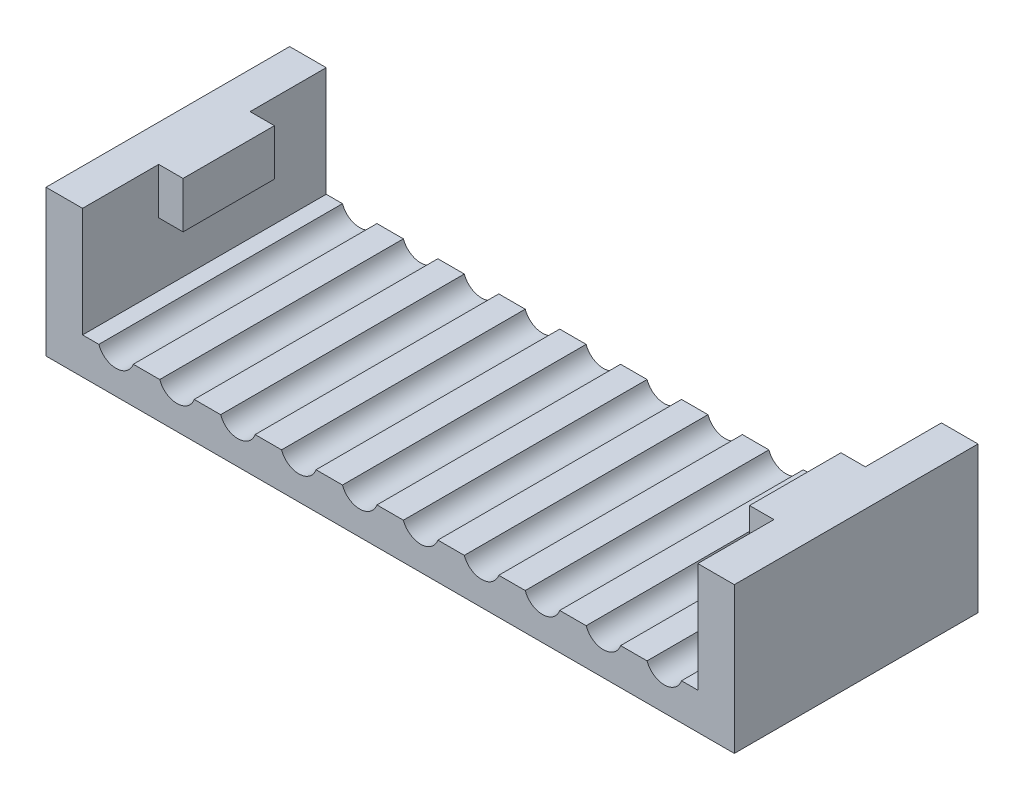
ISO-10303-21;
HEADER;
FILE_DESCRIPTION(('STEP AP214'),'2;1');
FILE_NAME('part.step','',(''),(''),'','','');
FILE_SCHEMA(('AUTOMOTIVE_DESIGN { 1 0 10303 214 1 1 1 1 }'));
ENDSEC;
DATA;
#1=APPLICATION_CONTEXT('core data for automotive mechanical design processes');
#2=APPLICATION_PROTOCOL_DEFINITION('international standard','automotive_design',2000,#1);
#3=PRODUCT_CONTEXT('',#1,'mechanical');
#4=PRODUCT('Part','Part','',(#3));
#5=PRODUCT_RELATED_PRODUCT_CATEGORY('part','',(#4));
#6=PRODUCT_DEFINITION_FORMATION('','',#4);
#7=PRODUCT_DEFINITION_CONTEXT('part definition',#1,'design');
#8=PRODUCT_DEFINITION('design','',#6,#7);
#9=PRODUCT_DEFINITION_SHAPE('','',#8);
#10=(LENGTH_UNIT() NAMED_UNIT(*) SI_UNIT(.MILLI.,.METRE.));
#11=(NAMED_UNIT(*) PLANE_ANGLE_UNIT() SI_UNIT($,.RADIAN.));
#12=(NAMED_UNIT(*) SI_UNIT($,.STERADIAN.) SOLID_ANGLE_UNIT());
#13=UNCERTAINTY_MEASURE_WITH_UNIT(LENGTH_MEASURE(1.E-05),#10,'distance_accuracy_value','');
#14=(GEOMETRIC_REPRESENTATION_CONTEXT(3) GLOBAL_UNCERTAINTY_ASSIGNED_CONTEXT((#13)) GLOBAL_UNIT_ASSIGNED_CONTEXT((#10,
#11,#12)) REPRESENTATION_CONTEXT('',''));
#15=CARTESIAN_POINT('',(0.,0.,0.));
#16=DIRECTION('',(0.,0.,1.));
#17=DIRECTION('',(1.,0.,0.));
#18=AXIS2_PLACEMENT_3D('',#15,#16,#17);
#19=CARTESIAN_POINT('',(-12.625,6.,10.));
#20=DIRECTION('',(-1.,0.,0.));
#21=DIRECTION('',(0.,0.,1.));
#22=AXIS2_PLACEMENT_3D('',#19,#20,#21);
#23=PLANE('',#22);
#24=DIRECTION('',(0.,1.,0.));
#25=VECTOR('',#24,1.);
#26=CARTESIAN_POINT('',(-12.625,6.,3.125));
#27=LINE('',#26,#25);
#28=CARTESIAN_POINT('',(-12.625,4.1,3.125));
#29=VERTEX_POINT('',#28);
#30=CARTESIAN_POINT('',(-12.625,6.,3.125));
#31=VERTEX_POINT('',#30);
#32=EDGE_CURVE('E288',#29,#31,#27,.T.);
#33=ORIENTED_EDGE('',*,*,#32,.F.);
#34=DIRECTION('',(0.,0.,-1.));
#35=VECTOR('',#34,1.);
#36=CARTESIAN_POINT('',(-12.625,4.1,6.875));
#37=LINE('',#36,#35);
#38=CARTESIAN_POINT('',(-12.625,4.1,6.875));
#39=VERTEX_POINT('',#38);
#40=EDGE_CURVE('E330',#39,#29,#37,.T.);
#41=ORIENTED_EDGE('',*,*,#40,.F.);
#42=DIRECTION('',(0.,-1.,0.));
#43=VECTOR('',#42,1.);
#44=CARTESIAN_POINT('',(-12.625,6.,6.875));
#45=LINE('',#44,#43);
#46=CARTESIAN_POINT('',(-12.625,6.,6.875));
#47=VERTEX_POINT('',#46);
#48=EDGE_CURVE('E342',#47,#39,#45,.T.);
#49=ORIENTED_EDGE('',*,*,#48,.F.);
#50=DIRECTION('',(0.,0.,-1.));
#51=VECTOR('',#50,1.);
#52=CARTESIAN_POINT('',(-12.625,6.,10.));
#53=LINE('',#52,#51);
#54=CARTESIAN_POINT('',(-12.625,6.,10.));
#55=VERTEX_POINT('',#54);
#56=EDGE_CURVE('E11',#55,#47,#53,.T.);
#57=ORIENTED_EDGE('',*,*,#56,.F.);
#58=DIRECTION('',(0.,1.,0.));
#59=VECTOR('',#58,1.);
#60=CARTESIAN_POINT('',(-12.625,6.,10.));
#61=LINE('',#60,#59);
#62=CARTESIAN_POINT('',(-12.625,1.5,10.));
#63=VERTEX_POINT('',#62);
#64=EDGE_CURVE('E512',#63,#55,#61,.T.);
#65=ORIENTED_EDGE('',*,*,#64,.F.);
#66=DIRECTION('',(0.,0.,-1.));
#67=VECTOR('',#66,1.);
#68=CARTESIAN_POINT('',(-12.625,1.5,10.));
#69=LINE('',#68,#67);
#70=CARTESIAN_POINT('',(-12.625,1.5,0.));
#71=VERTEX_POINT('',#70);
#72=EDGE_CURVE('E540',#63,#71,#69,.T.);
#73=ORIENTED_EDGE('',*,*,#72,.T.);
#74=DIRECTION('',(0.,1.,0.));
#75=VECTOR('',#74,1.);
#76=CARTESIAN_POINT('',(-12.625,6.,0.));
#77=LINE('',#76,#75);
#78=CARTESIAN_POINT('',(-12.625,6.,0.));
#79=VERTEX_POINT('',#78);
#80=EDGE_CURVE('E511',#71,#79,#77,.T.);
#81=ORIENTED_EDGE('',*,*,#80,.T.);
#82=EDGE_CURVE('E53',#31,#79,#53,.T.);
#83=ORIENTED_EDGE('',*,*,#82,.F.);
#84=EDGE_LOOP('',(#33,#41,#49,#57,#65,#73,#81,#83));
#85=FACE_BOUND('',#84,.T.);
#86=ADVANCED_FACE('F45',(#85),#23,.F.);
#87=CARTESIAN_POINT('',(12.625,1.50000000000001,10.));
#88=DIRECTION('',(0.,-1.,0.));
#89=DIRECTION('',(1.,0.,0.));
#90=AXIS2_PLACEMENT_3D('',#87,#88,#89);
#91=PLANE('',#90);
#92=DIRECTION('',(-1.,0.,0.));
#93=VECTOR('',#92,1.);
#94=CARTESIAN_POINT('',(12.625,1.50000000000001,0.));
#95=LINE('',#94,#93);
#96=CARTESIAN_POINT('',(-9.45710678118655,1.50000000000001,0.));
#97=VERTEX_POINT('',#96);
#98=CARTESIAN_POINT('',(-10.5428932188135,1.5,0.));
#99=VERTEX_POINT('',#98);
#100=EDGE_CURVE('E618',#97,#99,#95,.T.);
#101=ORIENTED_EDGE('',*,*,#100,.T.);
#102=DIRECTION('',(0.,0.,1.));
#103=VECTOR('',#102,1.);
#104=CARTESIAN_POINT('',(-10.5428932188135,1.5,0.));
#105=LINE('',#104,#103);
#106=CARTESIAN_POINT('',(-10.5428932188135,1.5,10.));
#107=VERTEX_POINT('',#106);
#108=EDGE_CURVE('E507',#99,#107,#105,.T.);
#109=ORIENTED_EDGE('',*,*,#108,.T.);
#110=DIRECTION('',(-1.,0.,0.));
#111=VECTOR('',#110,1.);
#112=CARTESIAN_POINT('',(12.625,1.50000000000001,10.));
#113=LINE('',#112,#111);
#114=CARTESIAN_POINT('',(-9.45710678118655,1.50000000000001,10.));
#115=VERTEX_POINT('',#114);
#116=EDGE_CURVE('E705',#115,#107,#113,.T.);
#117=ORIENTED_EDGE('',*,*,#116,.F.);
#118=DIRECTION('',(0.,0.,1.));
#119=VECTOR('',#118,1.);
#120=CARTESIAN_POINT('',(-9.45710678118655,1.50000000000001,0.));
#121=LINE('',#120,#119);
#122=EDGE_CURVE('E495',#115,#97,#121,.F.);
#123=ORIENTED_EDGE('',*,*,#122,.T.);
#124=EDGE_LOOP('',(#101,#109,#117,#123));
#125=FACE_BOUND('',#124,.T.);
#126=ADVANCED_FACE('F716',(#125),#91,.F.);
#127=CARTESIAN_POINT('',(-6.95710678118655,1.50000000000001,0.));
#128=VERTEX_POINT('',#127);
#129=CARTESIAN_POINT('',(-8.04289321881345,1.50000000000001,0.));
#130=VERTEX_POINT('',#129);
#131=EDGE_CURVE('E621',#128,#130,#95,.T.);
#132=ORIENTED_EDGE('',*,*,#131,.T.);
#133=DIRECTION('',(0.,0.,1.));
#134=VECTOR('',#133,1.);
#135=CARTESIAN_POINT('',(-8.04289321881345,1.50000000000001,0.));
#136=LINE('',#135,#134);
#137=CARTESIAN_POINT('',(-8.04289321881345,1.50000000000001,10.));
#138=VERTEX_POINT('',#137);
#139=EDGE_CURVE('E499',#130,#138,#136,.T.);
#140=ORIENTED_EDGE('',*,*,#139,.T.);
#141=CARTESIAN_POINT('',(-6.95710678118655,1.50000000000001,10.));
#142=VERTEX_POINT('',#141);
#143=EDGE_CURVE('E700',#142,#138,#113,.T.);
#144=ORIENTED_EDGE('',*,*,#143,.F.);
#145=DIRECTION('',(0.,0.,1.));
#146=VECTOR('',#145,1.);
#147=CARTESIAN_POINT('',(-6.95710678118655,1.50000000000001,0.));
#148=LINE('',#147,#146);
#149=EDGE_CURVE('E487',#142,#128,#148,.F.);
#150=ORIENTED_EDGE('',*,*,#149,.T.);
#151=EDGE_LOOP('',(#132,#140,#144,#150));
#152=FACE_BOUND('',#151,.T.);
#153=ADVANCED_FACE('F719',(#152),#91,.F.);
#154=CARTESIAN_POINT('',(-4.45710678118655,1.50000000000001,0.));
#155=VERTEX_POINT('',#154);
#156=CARTESIAN_POINT('',(-5.54289321881345,1.50000000000001,0.));
#157=VERTEX_POINT('',#156);
#158=EDGE_CURVE('E626',#155,#157,#95,.T.);
#159=ORIENTED_EDGE('',*,*,#158,.T.);
#160=DIRECTION('',(0.,0.,1.));
#161=VECTOR('',#160,1.);
#162=CARTESIAN_POINT('',(-5.54289321881345,1.50000000000001,0.));
#163=LINE('',#162,#161);
#164=CARTESIAN_POINT('',(-5.54289321881345,1.50000000000001,10.));
#165=VERTEX_POINT('',#164);
#166=EDGE_CURVE('E491',#157,#165,#163,.T.);
#167=ORIENTED_EDGE('',*,*,#166,.T.);
#168=CARTESIAN_POINT('',(-4.45710678118655,1.50000000000001,10.));
#169=VERTEX_POINT('',#168);
#170=EDGE_CURVE('E695',#169,#165,#113,.T.);
#171=ORIENTED_EDGE('',*,*,#170,.F.);
#172=DIRECTION('',(0.,0.,1.));
#173=VECTOR('',#172,1.);
#174=CARTESIAN_POINT('',(-4.45710678118655,1.50000000000001,0.));
#175=LINE('',#174,#173);
#176=EDGE_CURVE('E479',#169,#155,#175,.F.);
#177=ORIENTED_EDGE('',*,*,#176,.T.);
#178=EDGE_LOOP('',(#159,#167,#171,#177));
#179=FACE_BOUND('',#178,.T.);
#180=ADVANCED_FACE('F724',(#179),#91,.F.);
#181=CARTESIAN_POINT('',(-1.95710678118655,1.50000000000001,0.));
#182=VERTEX_POINT('',#181);
#183=CARTESIAN_POINT('',(-3.04289321881345,1.50000000000001,0.));
#184=VERTEX_POINT('',#183);
#185=EDGE_CURVE('E631',#182,#184,#95,.T.);
#186=ORIENTED_EDGE('',*,*,#185,.T.);
#187=DIRECTION('',(0.,0.,1.));
#188=VECTOR('',#187,1.);
#189=CARTESIAN_POINT('',(-3.04289321881345,1.50000000000001,0.));
#190=LINE('',#189,#188);
#191=CARTESIAN_POINT('',(-3.04289321881345,1.50000000000001,10.));
#192=VERTEX_POINT('',#191);
#193=EDGE_CURVE('E483',#184,#192,#190,.T.);
#194=ORIENTED_EDGE('',*,*,#193,.T.);
#195=CARTESIAN_POINT('',(-1.95710678118655,1.50000000000001,10.));
#196=VERTEX_POINT('',#195);
#197=EDGE_CURVE('E690',#196,#192,#113,.T.);
#198=ORIENTED_EDGE('',*,*,#197,.F.);
#199=DIRECTION('',(0.,0.,1.));
#200=VECTOR('',#199,1.);
#201=CARTESIAN_POINT('',(-1.95710678118655,1.50000000000001,0.));
#202=LINE('',#201,#200);
#203=EDGE_CURVE('E471',#196,#182,#202,.F.);
#204=ORIENTED_EDGE('',*,*,#203,.T.);
#205=EDGE_LOOP('',(#186,#194,#198,#204));
#206=FACE_BOUND('',#205,.T.);
#207=ADVANCED_FACE('F726',(#206),#91,.F.);
#208=CARTESIAN_POINT('',(0.542893218813453,1.50000000000001,0.));
#209=VERTEX_POINT('',#208);
#210=CARTESIAN_POINT('',(-0.542893218813451,1.50000000000001,0.));
#211=VERTEX_POINT('',#210);
#212=EDGE_CURVE('E636',#209,#211,#95,.T.);
#213=ORIENTED_EDGE('',*,*,#212,.T.);
#214=DIRECTION('',(0.,0.,1.));
#215=VECTOR('',#214,1.);
#216=CARTESIAN_POINT('',(-0.542893218813451,1.50000000000001,0.));
#217=LINE('',#216,#215);
#218=CARTESIAN_POINT('',(-0.542893218813451,1.50000000000001,10.));
#219=VERTEX_POINT('',#218);
#220=EDGE_CURVE('E475',#211,#219,#217,.T.);
#221=ORIENTED_EDGE('',*,*,#220,.T.);
#222=CARTESIAN_POINT('',(0.542893218813453,1.50000000000001,10.));
#223=VERTEX_POINT('',#222);
#224=EDGE_CURVE('E685',#223,#219,#113,.T.);
#225=ORIENTED_EDGE('',*,*,#224,.F.);
#226=DIRECTION('',(0.,0.,1.));
#227=VECTOR('',#226,1.);
#228=CARTESIAN_POINT('',(0.542893218813453,1.50000000000001,0.));
#229=LINE('',#228,#227);
#230=EDGE_CURVE('E463',#223,#209,#229,.F.);
#231=ORIENTED_EDGE('',*,*,#230,.T.);
#232=EDGE_LOOP('',(#213,#221,#225,#231));
#233=FACE_BOUND('',#232,.T.);
#234=ADVANCED_FACE('F732',(#233),#91,.F.);
#235=CARTESIAN_POINT('',(3.04289321881345,1.50000000000001,0.));
#236=VERTEX_POINT('',#235);
#237=CARTESIAN_POINT('',(1.95710678118655,1.50000000000001,0.));
#238=VERTEX_POINT('',#237);
#239=EDGE_CURVE('E641',#236,#238,#95,.T.);
#240=ORIENTED_EDGE('',*,*,#239,.T.);
#241=DIRECTION('',(0.,0.,1.));
#242=VECTOR('',#241,1.);
#243=CARTESIAN_POINT('',(1.95710678118655,1.50000000000001,0.));
#244=LINE('',#243,#242);
#245=CARTESIAN_POINT('',(1.95710678118655,1.50000000000001,10.));
#246=VERTEX_POINT('',#245);
#247=EDGE_CURVE('E467',#238,#246,#244,.T.);
#248=ORIENTED_EDGE('',*,*,#247,.T.);
#249=CARTESIAN_POINT('',(3.04289321881345,1.50000000000001,10.));
#250=VERTEX_POINT('',#249);
#251=EDGE_CURVE('E680',#250,#246,#113,.T.);
#252=ORIENTED_EDGE('',*,*,#251,.F.);
#253=DIRECTION('',(0.,0.,1.));
#254=VECTOR('',#253,1.);
#255=CARTESIAN_POINT('',(3.04289321881345,1.50000000000001,0.));
#256=LINE('',#255,#254);
#257=EDGE_CURVE('E455',#250,#236,#256,.F.);
#258=ORIENTED_EDGE('',*,*,#257,.T.);
#259=EDGE_LOOP('',(#240,#248,#252,#258));
#260=FACE_BOUND('',#259,.T.);
#261=ADVANCED_FACE('F1089',(#260),#91,.F.);
#262=CARTESIAN_POINT('',(5.54289321881345,1.50000000000001,0.));
#263=VERTEX_POINT('',#262);
#264=CARTESIAN_POINT('',(4.45710678118655,1.50000000000001,0.));
#265=VERTEX_POINT('',#264);
#266=EDGE_CURVE('E646',#263,#265,#95,.T.);
#267=ORIENTED_EDGE('',*,*,#266,.T.);
#268=DIRECTION('',(0.,0.,1.));
#269=VECTOR('',#268,1.);
#270=CARTESIAN_POINT('',(4.45710678118655,1.50000000000001,0.));
#271=LINE('',#270,#269);
#272=CARTESIAN_POINT('',(4.45710678118655,1.50000000000001,10.));
#273=VERTEX_POINT('',#272);
#274=EDGE_CURVE('E459',#265,#273,#271,.T.);
#275=ORIENTED_EDGE('',*,*,#274,.T.);
#276=CARTESIAN_POINT('',(5.54289321881345,1.50000000000001,10.));
#277=VERTEX_POINT('',#276);
#278=EDGE_CURVE('E676',#277,#273,#113,.T.);
#279=ORIENTED_EDGE('',*,*,#278,.F.);
#280=DIRECTION('',(0.,0.,1.));
#281=VECTOR('',#280,1.);
#282=CARTESIAN_POINT('',(5.54289321881345,1.50000000000001,0.));
#283=LINE('',#282,#281);
#284=EDGE_CURVE('E447',#277,#263,#283,.F.);
#285=ORIENTED_EDGE('',*,*,#284,.T.);
#286=EDGE_LOOP('',(#267,#275,#279,#285));
#287=FACE_BOUND('',#286,.T.);
#288=ADVANCED_FACE('F1097',(#287),#91,.F.);
#289=CARTESIAN_POINT('',(8.04289321881345,1.50000000000001,0.));
#290=VERTEX_POINT('',#289);
#291=CARTESIAN_POINT('',(6.95710678118655,1.50000000000001,0.));
#292=VERTEX_POINT('',#291);
#293=EDGE_CURVE('E651',#290,#292,#95,.T.);
#294=ORIENTED_EDGE('',*,*,#293,.T.);
#295=DIRECTION('',(0.,0.,1.));
#296=VECTOR('',#295,1.);
#297=CARTESIAN_POINT('',(6.95710678118655,1.50000000000001,0.));
#298=LINE('',#297,#296);
#299=CARTESIAN_POINT('',(6.95710678118655,1.50000000000001,10.));
#300=VERTEX_POINT('',#299);
#301=EDGE_CURVE('E451',#292,#300,#298,.T.);
#302=ORIENTED_EDGE('',*,*,#301,.T.);
#303=CARTESIAN_POINT('',(8.04289321881345,1.50000000000001,10.));
#304=VERTEX_POINT('',#303);
#305=EDGE_CURVE('E672',#304,#300,#113,.T.);
#306=ORIENTED_EDGE('',*,*,#305,.F.);
#307=DIRECTION('',(0.,0.,1.));
#308=VECTOR('',#307,1.);
#309=CARTESIAN_POINT('',(8.04289321881345,1.50000000000001,0.));
#310=LINE('',#309,#308);
#311=EDGE_CURVE('E439',#304,#290,#310,.F.);
#312=ORIENTED_EDGE('',*,*,#311,.T.);
#313=EDGE_LOOP('',(#294,#302,#306,#312));
#314=FACE_BOUND('',#313,.T.);
#315=ADVANCED_FACE('F670',(#314),#91,.F.);
#316=CARTESIAN_POINT('',(10.5428932188134,1.50000000000001,0.));
#317=VERTEX_POINT('',#316);
#318=CARTESIAN_POINT('',(9.45710678118655,1.50000000000001,0.));
#319=VERTEX_POINT('',#318);
#320=EDGE_CURVE('E568',#317,#319,#95,.T.);
#321=ORIENTED_EDGE('',*,*,#320,.T.);
#322=DIRECTION('',(0.,0.,1.));
#323=VECTOR('',#322,1.);
#324=CARTESIAN_POINT('',(9.45710678118655,1.50000000000001,0.));
#325=LINE('',#324,#323);
#326=CARTESIAN_POINT('',(9.45710678118655,1.50000000000001,10.));
#327=VERTEX_POINT('',#326);
#328=EDGE_CURVE('E443',#319,#327,#325,.T.);
#329=ORIENTED_EDGE('',*,*,#328,.T.);
#330=CARTESIAN_POINT('',(10.5428932188134,1.50000000000001,10.));
#331=VERTEX_POINT('',#330);
#332=EDGE_CURVE('E541',#331,#327,#113,.T.);
#333=ORIENTED_EDGE('',*,*,#332,.F.);
#334=DIRECTION('',(0.,0.,1.));
#335=VECTOR('',#334,1.);
#336=CARTESIAN_POINT('',(10.5428932188134,1.50000000000001,0.));
#337=LINE('',#336,#335);
#338=EDGE_CURVE('E366',#331,#317,#337,.F.);
#339=ORIENTED_EDGE('',*,*,#338,.T.);
#340=EDGE_LOOP('',(#321,#329,#333,#339));
#341=FACE_BOUND('',#340,.T.);
#342=ADVANCED_FACE('F662',(#341),#91,.F.);
#343=CARTESIAN_POINT('',(12.625,1.50000000000001,0.));
#344=VERTEX_POINT('',#343);
#345=CARTESIAN_POINT('',(11.9571067811865,1.50000000000001,0.));
#346=VERTEX_POINT('',#345);
#347=EDGE_CURVE('E517',#344,#346,#95,.T.);
#348=ORIENTED_EDGE('',*,*,#347,.T.);
#349=DIRECTION('',(0.,0.,1.));
#350=VECTOR('',#349,1.);
#351=CARTESIAN_POINT('',(11.9571067811865,1.50000000000001,0.));
#352=LINE('',#351,#350);
#353=CARTESIAN_POINT('',(11.9571067811865,1.50000000000001,10.));
#354=VERTEX_POINT('',#353);
#355=EDGE_CURVE('E435',#346,#354,#352,.T.);
#356=ORIENTED_EDGE('',*,*,#355,.T.);
#357=CARTESIAN_POINT('',(12.625,1.50000000000001,10.));
#358=VERTEX_POINT('',#357);
#359=EDGE_CURVE('E536',#358,#354,#113,.T.);
#360=ORIENTED_EDGE('',*,*,#359,.F.);
#361=DIRECTION('',(0.,0.,-1.));
#362=VECTOR('',#361,1.);
#363=CARTESIAN_POINT('',(12.625,1.50000000000001,10.));
#364=LINE('',#363,#362);
#365=EDGE_CURVE('E572',#358,#344,#364,.T.);
#366=ORIENTED_EDGE('',*,*,#365,.T.);
#367=EDGE_LOOP('',(#348,#356,#360,#366));
#368=FACE_BOUND('',#367,.T.);
#369=ADVANCED_FACE('F743',(#368),#91,.F.);
#370=CARTESIAN_POINT('',(-12.625,6.,10.));
#371=DIRECTION('',(0.,-1.,0.));
#372=DIRECTION('',(0.,0.,-1.));
#373=AXIS2_PLACEMENT_3D('',#370,#371,#372);
#374=PLANE('',#373);
#375=DIRECTION('',(-1.,0.,0.));
#376=VECTOR('',#375,1.);
#377=CARTESIAN_POINT('',(-12.625,6.,0.));
#378=LINE('',#377,#376);
#379=CARTESIAN_POINT('',(-14.125,6.,0.));
#380=VERTEX_POINT('',#379);
#381=EDGE_CURVE('E545',#79,#380,#378,.T.);
#382=ORIENTED_EDGE('',*,*,#381,.T.);
#383=DIRECTION('',(0.,0.,-1.));
#384=VECTOR('',#383,1.);
#385=CARTESIAN_POINT('',(-14.125,6.,10.));
#386=LINE('',#385,#384);
#387=CARTESIAN_POINT('',(-14.125,6.,10.));
#388=VERTEX_POINT('',#387);
#389=EDGE_CURVE('E591',#388,#380,#386,.T.);
#390=ORIENTED_EDGE('',*,*,#389,.F.);
#391=DIRECTION('',(-1.,0.,0.));
#392=VECTOR('',#391,1.);
#393=CARTESIAN_POINT('',(-12.625,6.,10.));
#394=LINE('',#393,#392);
#395=EDGE_CURVE('E516',#55,#388,#394,.T.);
#396=ORIENTED_EDGE('',*,*,#395,.F.);
#397=ORIENTED_EDGE('',*,*,#56,.T.);
#398=DIRECTION('',(-1.,0.,0.));
#399=VECTOR('',#398,1.);
#400=CARTESIAN_POINT('',(-11.625,6.,6.875));
#401=LINE('',#400,#399);
#402=CARTESIAN_POINT('',(-11.625,6.,6.875));
#403=VERTEX_POINT('',#402);
#404=EDGE_CURVE('E354',#403,#47,#401,.T.);
#405=ORIENTED_EDGE('',*,*,#404,.F.);
#406=DIRECTION('',(0.,0.,1.));
#407=VECTOR('',#406,1.);
#408=CARTESIAN_POINT('',(-11.625,6.,6.875));
#409=LINE('',#408,#407);
#410=CARTESIAN_POINT('',(-11.625,6.,3.125));
#411=VERTEX_POINT('',#410);
#412=EDGE_CURVE('E329',#411,#403,#409,.T.);
#413=ORIENTED_EDGE('',*,*,#412,.F.);
#414=DIRECTION('',(-1.,0.,0.));
#415=VECTOR('',#414,1.);
#416=CARTESIAN_POINT('',(-11.625,6.,3.125));
#417=LINE('',#416,#415);
#418=EDGE_CURVE('E357',#411,#31,#417,.T.);
#419=ORIENTED_EDGE('',*,*,#418,.T.);
#420=ORIENTED_EDGE('',*,*,#82,.T.);
#421=EDGE_LOOP('',(#382,#390,#396,#397,#405,#413,#419,#420));
#422=FACE_BOUND('',#421,.T.);
#423=ADVANCED_FACE('F602',(#422),#374,.F.);
#424=CARTESIAN_POINT('',(-14.125,6.,10.));
#425=DIRECTION('',(1.,0.,0.));
#426=DIRECTION('',(0.,0.,-1.));
#427=AXIS2_PLACEMENT_3D('',#424,#425,#426);
#428=PLANE('',#427);
#429=DIRECTION('',(0.,-1.,0.));
#430=VECTOR('',#429,1.);
#431=CARTESIAN_POINT('',(-14.125,6.,0.));
#432=LINE('',#431,#430);
#433=CARTESIAN_POINT('',(-14.125,0.,0.));
#434=VERTEX_POINT('',#433);
#435=EDGE_CURVE('E548',#380,#434,#432,.T.);
#436=ORIENTED_EDGE('',*,*,#435,.T.);
#437=DIRECTION('',(0.,0.,-1.));
#438=VECTOR('',#437,1.);
#439=CARTESIAN_POINT('',(-14.125,0.,10.));
#440=LINE('',#439,#438);
#441=CARTESIAN_POINT('',(-14.125,0.,10.));
#442=VERTEX_POINT('',#441);
#443=EDGE_CURVE('E588',#442,#434,#440,.T.);
#444=ORIENTED_EDGE('',*,*,#443,.F.);
#445=DIRECTION('',(0.,-1.,0.));
#446=VECTOR('',#445,1.);
#447=CARTESIAN_POINT('',(-14.125,6.,10.));
#448=LINE('',#447,#446);
#449=EDGE_CURVE('E520',#388,#442,#448,.T.);
#450=ORIENTED_EDGE('',*,*,#449,.F.);
#451=ORIENTED_EDGE('',*,*,#389,.T.);
#452=EDGE_LOOP('',(#436,#444,#450,#451));
#453=FACE_BOUND('',#452,.T.);
#454=ADVANCED_FACE('F756',(#453),#428,.F.);
#455=CARTESIAN_POINT('',(-14.125,0.,10.));
#456=DIRECTION('',(0.,1.,0.));
#457=DIRECTION('',(-1.,0.,0.));
#458=AXIS2_PLACEMENT_3D('',#455,#456,#457);
#459=PLANE('',#458);
#460=DIRECTION('',(1.,0.,0.));
#461=VECTOR('',#460,1.);
#462=CARTESIAN_POINT('',(-14.125,0.,0.));
#463=LINE('',#462,#461);
#464=CARTESIAN_POINT('',(14.125,0.,0.));
#465=VERTEX_POINT('',#464);
#466=EDGE_CURVE('E551',#434,#465,#463,.T.);
#467=ORIENTED_EDGE('',*,*,#466,.T.);
#468=DIRECTION('',(0.,0.,-1.));
#469=VECTOR('',#468,1.);
#470=CARTESIAN_POINT('',(14.125,0.,10.));
#471=LINE('',#470,#469);
#472=CARTESIAN_POINT('',(14.125,0.,10.));
#473=VERTEX_POINT('',#472);
#474=EDGE_CURVE('E584',#473,#465,#471,.T.);
#475=ORIENTED_EDGE('',*,*,#474,.F.);
#476=DIRECTION('',(1.,0.,0.));
#477=VECTOR('',#476,1.);
#478=CARTESIAN_POINT('',(-14.125,0.,10.));
#479=LINE('',#478,#477);
#480=EDGE_CURVE('E523',#442,#473,#479,.T.);
#481=ORIENTED_EDGE('',*,*,#480,.F.);
#482=ORIENTED_EDGE('',*,*,#443,.T.);
#483=EDGE_LOOP('',(#467,#475,#481,#482));
#484=FACE_BOUND('',#483,.T.);
#485=ADVANCED_FACE('F773',(#484),#459,.F.);
#486=CARTESIAN_POINT('',(14.125,0.,10.));
#487=DIRECTION('',(-1.,0.,0.));
#488=DIRECTION('',(0.,-1.,0.));
#489=AXIS2_PLACEMENT_3D('',#486,#487,#488);
#490=PLANE('',#489);
#491=DIRECTION('',(0.,1.,0.));
#492=VECTOR('',#491,1.);
#493=CARTESIAN_POINT('',(14.125,0.,0.));
#494=LINE('',#493,#492);
#495=CARTESIAN_POINT('',(14.125,6.00000000000002,0.));
#496=VERTEX_POINT('',#495);
#497=EDGE_CURVE('E554',#465,#496,#494,.T.);
#498=ORIENTED_EDGE('',*,*,#497,.T.);
#499=DIRECTION('',(0.,0.,-1.));
#500=VECTOR('',#499,1.);
#501=CARTESIAN_POINT('',(14.125,6.00000000000002,10.));
#502=LINE('',#501,#500);
#503=CARTESIAN_POINT('',(14.125,6.00000000000002,10.));
#504=VERTEX_POINT('',#503);
#505=EDGE_CURVE('E580',#504,#496,#502,.T.);
#506=ORIENTED_EDGE('',*,*,#505,.F.);
#507=DIRECTION('',(0.,1.,0.));
#508=VECTOR('',#507,1.);
#509=CARTESIAN_POINT('',(14.125,0.,10.));
#510=LINE('',#509,#508);
#511=EDGE_CURVE('E526',#473,#504,#510,.T.);
#512=ORIENTED_EDGE('',*,*,#511,.F.);
#513=ORIENTED_EDGE('',*,*,#474,.T.);
#514=EDGE_LOOP('',(#498,#506,#512,#513));
#515=FACE_BOUND('',#514,.T.);
#516=ADVANCED_FACE('F770',(#515),#490,.F.);
#517=CARTESIAN_POINT('',(14.125,6.00000000000002,10.));
#518=DIRECTION('',(0.,-1.,0.));
#519=DIRECTION('',(1.,0.,0.));
#520=AXIS2_PLACEMENT_3D('',#517,#518,#519);
#521=PLANE('',#520);
#522=DIRECTION('',(-1.,0.,0.));
#523=VECTOR('',#522,1.);
#524=CARTESIAN_POINT('',(14.125,6.00000000000002,0.));
#525=LINE('',#524,#523);
#526=CARTESIAN_POINT('',(12.625,6.00000000000001,0.));
#527=VERTEX_POINT('',#526);
#528=EDGE_CURVE('E557',#496,#527,#525,.T.);
#529=ORIENTED_EDGE('',*,*,#528,.T.);
#530=DIRECTION('',(0.,0.,-1.));
#531=VECTOR('',#530,1.);
#532=CARTESIAN_POINT('',(12.625,6.00000000000001,10.));
#533=LINE('',#532,#531);
#534=CARTESIAN_POINT('',(12.625,6.,3.125));
#535=VERTEX_POINT('',#534);
#536=EDGE_CURVE('E576',#535,#527,#533,.T.);
#537=ORIENTED_EDGE('',*,*,#536,.F.);
#538=DIRECTION('',(1.,0.,0.));
#539=VECTOR('',#538,1.);
#540=CARTESIAN_POINT('',(11.625,6.,3.125));
#541=LINE('',#540,#539);
#542=CARTESIAN_POINT('',(11.625,6.,3.125));
#543=VERTEX_POINT('',#542);
#544=EDGE_CURVE('E310',#543,#535,#541,.T.);
#545=ORIENTED_EDGE('',*,*,#544,.F.);
#546=DIRECTION('',(0.,0.,1.));
#547=VECTOR('',#546,1.);
#548=CARTESIAN_POINT('',(11.625,6.,6.875));
#549=LINE('',#548,#547);
#550=CARTESIAN_POINT('',(11.625,6.,6.875));
#551=VERTEX_POINT('',#550);
#552=EDGE_CURVE('E298',#543,#551,#549,.T.);
#553=ORIENTED_EDGE('',*,*,#552,.T.);
#554=DIRECTION('',(1.,0.,0.));
#555=VECTOR('',#554,1.);
#556=CARTESIAN_POINT('',(11.625,6.,6.875));
#557=LINE('',#556,#555);
#558=CARTESIAN_POINT('',(12.625,6.00000000000001,6.875));
#559=VERTEX_POINT('',#558);
#560=EDGE_CURVE('E319',#551,#559,#557,.T.);
#561=ORIENTED_EDGE('',*,*,#560,.T.);
#562=CARTESIAN_POINT('',(12.625,6.00000000000001,10.));
#563=VERTEX_POINT('',#562);
#564=EDGE_CURVE('E577',#563,#559,#533,.T.);
#565=ORIENTED_EDGE('',*,*,#564,.F.);
#566=DIRECTION('',(-1.,0.,0.));
#567=VECTOR('',#566,1.);
#568=CARTESIAN_POINT('',(14.125,6.00000000000002,10.));
#569=LINE('',#568,#567);
#570=EDGE_CURVE('E529',#504,#563,#569,.T.);
#571=ORIENTED_EDGE('',*,*,#570,.F.);
#572=ORIENTED_EDGE('',*,*,#505,.T.);
#573=EDGE_LOOP('',(#529,#537,#545,#553,#561,#565,#571,#572));
#574=FACE_BOUND('',#573,.T.);
#575=ADVANCED_FACE('F749',(#574),#521,.F.);
#576=CARTESIAN_POINT('',(12.625,6.00000000000001,10.));
#577=DIRECTION('',(1.,0.,0.));
#578=DIRECTION('',(0.,1.,0.));
#579=AXIS2_PLACEMENT_3D('',#576,#577,#578);
#580=PLANE('',#579);
#581=DIRECTION('',(0.,0.,-1.));
#582=VECTOR('',#581,1.);
#583=CARTESIAN_POINT('',(12.625,4.1,6.875));
#584=LINE('',#583,#582);
#585=CARTESIAN_POINT('',(12.625,4.1,6.875));
#586=VERTEX_POINT('',#585);
#587=CARTESIAN_POINT('',(12.625,4.1,3.125));
#588=VERTEX_POINT('',#587);
#589=EDGE_CURVE('E60',#586,#588,#584,.T.);
#590=ORIENTED_EDGE('',*,*,#589,.T.);
#591=DIRECTION('',(0.,1.,0.));
#592=VECTOR('',#591,1.);
#593=CARTESIAN_POINT('',(12.625,6.,3.125));
#594=LINE('',#593,#592);
#595=EDGE_CURVE('E284',#588,#535,#594,.T.);
#596=ORIENTED_EDGE('',*,*,#595,.T.);
#597=ORIENTED_EDGE('',*,*,#536,.T.);
#598=DIRECTION('',(0.,-1.,0.));
#599=VECTOR('',#598,1.);
#600=CARTESIAN_POINT('',(12.625,6.00000000000001,0.));
#601=LINE('',#600,#599);
#602=EDGE_CURVE('E561',#527,#344,#601,.T.);
#603=ORIENTED_EDGE('',*,*,#602,.T.);
#604=ORIENTED_EDGE('',*,*,#365,.F.);
#605=DIRECTION('',(0.,-1.,0.));
#606=VECTOR('',#605,1.);
#607=CARTESIAN_POINT('',(12.625,6.00000000000001,10.));
#608=LINE('',#607,#606);
#609=EDGE_CURVE('E532',#563,#358,#608,.T.);
#610=ORIENTED_EDGE('',*,*,#609,.F.);
#611=ORIENTED_EDGE('',*,*,#564,.T.);
#612=DIRECTION('',(0.,-1.,0.));
#613=VECTOR('',#612,1.);
#614=CARTESIAN_POINT('',(12.625,6.,6.875));
#615=LINE('',#614,#613);
#616=EDGE_CURVE('E65',#559,#586,#615,.T.);
#617=ORIENTED_EDGE('',*,*,#616,.T.);
#618=EDGE_LOOP('',(#590,#596,#597,#603,#604,#610,#611,#617));
#619=FACE_BOUND('',#618,.T.);
#620=ADVANCED_FACE('F742',(#619),#580,.F.);
#621=CARTESIAN_POINT('',(-11.9571067811865,1.5,10.));
#622=VERTEX_POINT('',#621);
#623=EDGE_CURVE('E535',#622,#63,#113,.T.);
#624=ORIENTED_EDGE('',*,*,#623,.F.);
#625=DIRECTION('',(0.,0.,1.));
#626=VECTOR('',#625,1.);
#627=CARTESIAN_POINT('',(-11.9571067811865,1.5,0.));
#628=LINE('',#627,#626);
#629=CARTESIAN_POINT('',(-11.9571067811865,1.5,0.));
#630=VERTEX_POINT('',#629);
#631=EDGE_CURVE('E503',#622,#630,#628,.F.);
#632=ORIENTED_EDGE('',*,*,#631,.T.);
#633=EDGE_CURVE('E564',#630,#71,#95,.T.);
#634=ORIENTED_EDGE('',*,*,#633,.T.);
#635=ORIENTED_EDGE('',*,*,#72,.F.);
#636=EDGE_LOOP('',(#624,#632,#634,#635));
#637=FACE_BOUND('',#636,.T.);
#638=ADVANCED_FACE('F616',(#637),#91,.F.);
#639=CARTESIAN_POINT('',(0.,0.,10.));
#640=DIRECTION('',(0.,0.,-1.));
#641=DIRECTION('',(-1.,0.,0.));
#642=AXIS2_PLACEMENT_3D('',#639,#640,#641);
#643=PLANE('',#642);
#644=ORIENTED_EDGE('',*,*,#116,.T.);
#645=CARTESIAN_POINT('',(-11.25,1.75,10.));
#646=DIRECTION('',(0.,0.,1.));
#647=DIRECTION('',(1.,0.,0.));
#648=AXIS2_PLACEMENT_3D('',#645,#646,#647);
#649=CIRCLE('',#648,0.75);
#650=EDGE_CURVE('E367',#622,#107,#649,.T.);
#651=ORIENTED_EDGE('',*,*,#650,.F.);
#652=ORIENTED_EDGE('',*,*,#623,.T.);
#653=ORIENTED_EDGE('',*,*,#64,.T.);
#654=ORIENTED_EDGE('',*,*,#395,.T.);
#655=ORIENTED_EDGE('',*,*,#449,.T.);
#656=ORIENTED_EDGE('',*,*,#480,.T.);
#657=ORIENTED_EDGE('',*,*,#511,.T.);
#658=ORIENTED_EDGE('',*,*,#570,.T.);
#659=ORIENTED_EDGE('',*,*,#609,.T.);
#660=ORIENTED_EDGE('',*,*,#359,.T.);
#661=CARTESIAN_POINT('',(11.25,1.75000000000001,10.));
#662=DIRECTION('',(0.,0.,1.));
#663=DIRECTION('',(1.,0.,0.));
#664=AXIS2_PLACEMENT_3D('',#661,#662,#663);
#665=CIRCLE('',#664,0.75);
#666=EDGE_CURVE('E426',#331,#354,#665,.T.);
#667=ORIENTED_EDGE('',*,*,#666,.F.);
#668=ORIENTED_EDGE('',*,*,#332,.T.);
#669=CARTESIAN_POINT('',(8.75,1.75000000000001,10.));
#670=DIRECTION('',(0.,0.,1.));
#671=DIRECTION('',(1.,0.,0.));
#672=AXIS2_PLACEMENT_3D('',#669,#670,#671);
#673=CIRCLE('',#672,0.75);
#674=EDGE_CURVE('E419',#304,#327,#673,.T.);
#675=ORIENTED_EDGE('',*,*,#674,.F.);
#676=ORIENTED_EDGE('',*,*,#305,.T.);
#677=CARTESIAN_POINT('',(6.25,1.75000000000001,10.));
#678=DIRECTION('',(0.,0.,1.));
#679=DIRECTION('',(1.,0.,0.));
#680=AXIS2_PLACEMENT_3D('',#677,#678,#679);
#681=CIRCLE('',#680,0.75);
#682=EDGE_CURVE('E412',#277,#300,#681,.T.);
#683=ORIENTED_EDGE('',*,*,#682,.F.);
#684=ORIENTED_EDGE('',*,*,#278,.T.);
#685=CARTESIAN_POINT('',(3.75,1.75000000000001,10.));
#686=DIRECTION('',(0.,0.,1.));
#687=DIRECTION('',(1.,0.,0.));
#688=AXIS2_PLACEMENT_3D('',#685,#686,#687);
#689=CIRCLE('',#688,0.75);
#690=EDGE_CURVE('E405',#250,#273,#689,.T.);
#691=ORIENTED_EDGE('',*,*,#690,.F.);
#692=ORIENTED_EDGE('',*,*,#251,.T.);
#693=CARTESIAN_POINT('',(1.25,1.75000000000001,10.));
#694=DIRECTION('',(0.,0.,1.));
#695=DIRECTION('',(1.,0.,0.));
#696=AXIS2_PLACEMENT_3D('',#693,#694,#695);
#697=CIRCLE('',#696,0.75);
#698=EDGE_CURVE('E398',#223,#246,#697,.T.);
#699=ORIENTED_EDGE('',*,*,#698,.F.);
#700=ORIENTED_EDGE('',*,*,#224,.T.);
#701=CARTESIAN_POINT('',(-1.25,1.75000000000001,10.));
#702=DIRECTION('',(0.,0.,1.));
#703=DIRECTION('',(1.,0.,0.));
#704=AXIS2_PLACEMENT_3D('',#701,#702,#703);
#705=CIRCLE('',#704,0.75);
#706=EDGE_CURVE('E391',#196,#219,#705,.T.);
#707=ORIENTED_EDGE('',*,*,#706,.F.);
#708=ORIENTED_EDGE('',*,*,#197,.T.);
#709=CARTESIAN_POINT('',(-3.75,1.75000000000001,10.));
#710=DIRECTION('',(0.,0.,1.));
#711=DIRECTION('',(1.,0.,0.));
#712=AXIS2_PLACEMENT_3D('',#709,#710,#711);
#713=CIRCLE('',#712,0.75);
#714=EDGE_CURVE('E384',#169,#192,#713,.T.);
#715=ORIENTED_EDGE('',*,*,#714,.F.);
#716=ORIENTED_EDGE('',*,*,#170,.T.);
#717=CARTESIAN_POINT('',(-6.25,1.75000000000001,10.));
#718=DIRECTION('',(0.,0.,1.));
#719=DIRECTION('',(1.,0.,0.));
#720=AXIS2_PLACEMENT_3D('',#717,#718,#719);
#721=CIRCLE('',#720,0.749999999999999);
#722=EDGE_CURVE('E377',#142,#165,#721,.T.);
#723=ORIENTED_EDGE('',*,*,#722,.F.);
#724=ORIENTED_EDGE('',*,*,#143,.T.);
#725=CARTESIAN_POINT('',(-8.75,1.75000000000001,10.));
#726=DIRECTION('',(0.,0.,1.));
#727=DIRECTION('',(1.,0.,0.));
#728=AXIS2_PLACEMENT_3D('',#725,#726,#727);
#729=CIRCLE('',#728,0.75);
#730=EDGE_CURVE('E370',#115,#138,#729,.T.);
#731=ORIENTED_EDGE('',*,*,#730,.F.);
#732=EDGE_LOOP('',(#644,#651,#652,#653,#654,#655,#656,#657,#658,#659,#660,#667,#668,#675,#676,
#683,#684,#691,#692,#699,#700,#707,#708,#715,#716,#723,#724,#731));
#733=FACE_BOUND('',#732,.T.);
#734=ADVANCED_FACE('F713',(#733),#643,.F.);
#735=CARTESIAN_POINT('',(0.,0.,0.));
#736=DIRECTION('',(0.,0.,-1.));
#737=DIRECTION('',(-1.,0.,0.));
#738=AXIS2_PLACEMENT_3D('',#735,#736,#737);
#739=PLANE('',#738);
#740=CARTESIAN_POINT('',(-11.25,1.75,0.));
#741=DIRECTION('',(0.,0.,1.));
#742=DIRECTION('',(1.,0.,0.));
#743=AXIS2_PLACEMENT_3D('',#740,#741,#742);
#744=CIRCLE('',#743,0.75);
#745=EDGE_CURVE('E362',#630,#99,#744,.T.);
#746=ORIENTED_EDGE('',*,*,#745,.T.);
#747=ORIENTED_EDGE('',*,*,#100,.F.);
#748=CARTESIAN_POINT('',(-8.75,1.75000000000001,0.));
#749=DIRECTION('',(0.,0.,1.));
#750=DIRECTION('',(1.,0.,0.));
#751=AXIS2_PLACEMENT_3D('',#748,#749,#750);
#752=CIRCLE('',#751,0.75);
#753=EDGE_CURVE('E373',#97,#130,#752,.T.);
#754=ORIENTED_EDGE('',*,*,#753,.T.);
#755=ORIENTED_EDGE('',*,*,#131,.F.);
#756=CARTESIAN_POINT('',(-6.25,1.75000000000001,0.));
#757=DIRECTION('',(0.,0.,1.));
#758=DIRECTION('',(1.,0.,0.));
#759=AXIS2_PLACEMENT_3D('',#756,#757,#758);
#760=CIRCLE('',#759,0.749999999999999);
#761=EDGE_CURVE('E380',#128,#157,#760,.T.);
#762=ORIENTED_EDGE('',*,*,#761,.T.);
#763=ORIENTED_EDGE('',*,*,#158,.F.);
#764=CARTESIAN_POINT('',(-3.75,1.75000000000001,0.));
#765=DIRECTION('',(0.,0.,1.));
#766=DIRECTION('',(1.,0.,0.));
#767=AXIS2_PLACEMENT_3D('',#764,#765,#766);
#768=CIRCLE('',#767,0.75);
#769=EDGE_CURVE('E387',#155,#184,#768,.T.);
#770=ORIENTED_EDGE('',*,*,#769,.T.);
#771=ORIENTED_EDGE('',*,*,#185,.F.);
#772=CARTESIAN_POINT('',(-1.25,1.75000000000001,0.));
#773=DIRECTION('',(0.,0.,1.));
#774=DIRECTION('',(1.,0.,0.));
#775=AXIS2_PLACEMENT_3D('',#772,#773,#774);
#776=CIRCLE('',#775,0.75);
#777=EDGE_CURVE('E394',#182,#211,#776,.T.);
#778=ORIENTED_EDGE('',*,*,#777,.T.);
#779=ORIENTED_EDGE('',*,*,#212,.F.);
#780=CARTESIAN_POINT('',(1.25,1.75000000000001,0.));
#781=DIRECTION('',(0.,0.,1.));
#782=DIRECTION('',(1.,0.,0.));
#783=AXIS2_PLACEMENT_3D('',#780,#781,#782);
#784=CIRCLE('',#783,0.75);
#785=EDGE_CURVE('E401',#209,#238,#784,.T.);
#786=ORIENTED_EDGE('',*,*,#785,.T.);
#787=ORIENTED_EDGE('',*,*,#239,.F.);
#788=CARTESIAN_POINT('',(3.75,1.75000000000001,0.));
#789=DIRECTION('',(0.,0.,1.));
#790=DIRECTION('',(1.,0.,0.));
#791=AXIS2_PLACEMENT_3D('',#788,#789,#790);
#792=CIRCLE('',#791,0.75);
#793=EDGE_CURVE('E408',#236,#265,#792,.T.);
#794=ORIENTED_EDGE('',*,*,#793,.T.);
#795=ORIENTED_EDGE('',*,*,#266,.F.);
#796=CARTESIAN_POINT('',(6.25,1.75000000000001,0.));
#797=DIRECTION('',(0.,0.,1.));
#798=DIRECTION('',(1.,0.,0.));
#799=AXIS2_PLACEMENT_3D('',#796,#797,#798);
#800=CIRCLE('',#799,0.75);
#801=EDGE_CURVE('E415',#263,#292,#800,.T.);
#802=ORIENTED_EDGE('',*,*,#801,.T.);
#803=ORIENTED_EDGE('',*,*,#293,.F.);
#804=CARTESIAN_POINT('',(8.75,1.75000000000001,0.));
#805=DIRECTION('',(0.,0.,1.));
#806=DIRECTION('',(1.,0.,0.));
#807=AXIS2_PLACEMENT_3D('',#804,#805,#806);
#808=CIRCLE('',#807,0.75);
#809=EDGE_CURVE('E422',#290,#319,#808,.T.);
#810=ORIENTED_EDGE('',*,*,#809,.T.);
#811=ORIENTED_EDGE('',*,*,#320,.F.);
#812=CARTESIAN_POINT('',(11.25,1.75000000000001,0.));
#813=DIRECTION('',(0.,0.,1.));
#814=DIRECTION('',(1.,0.,0.));
#815=AXIS2_PLACEMENT_3D('',#812,#813,#814);
#816=CIRCLE('',#815,0.75);
#817=EDGE_CURVE('E361',#317,#346,#816,.T.);
#818=ORIENTED_EDGE('',*,*,#817,.T.);
#819=ORIENTED_EDGE('',*,*,#347,.F.);
#820=ORIENTED_EDGE('',*,*,#602,.F.);
#821=ORIENTED_EDGE('',*,*,#528,.F.);
#822=ORIENTED_EDGE('',*,*,#497,.F.);
#823=ORIENTED_EDGE('',*,*,#466,.F.);
#824=ORIENTED_EDGE('',*,*,#435,.F.);
#825=ORIENTED_EDGE('',*,*,#381,.F.);
#826=ORIENTED_EDGE('',*,*,#80,.F.);
#827=ORIENTED_EDGE('',*,*,#633,.F.);
#828=EDGE_LOOP('',(#746,#747,#754,#755,#762,#763,#770,#771,#778,#779,#786,#787,#794,#795,#802,
#803,#810,#811,#818,#819,#820,#821,#822,#823,#824,#825,#826,#827));
#829=FACE_BOUND('',#828,.T.);
#830=ADVANCED_FACE('F608',(#829),#739,.T.);
#831=CARTESIAN_POINT('',(11.25,1.75000000000001,0.));
#832=DIRECTION('',(0.,0.,1.));
#833=DIRECTION('',(1.,0.,0.));
#834=AXIS2_PLACEMENT_3D('',#831,#832,#833);
#835=CYLINDRICAL_SURFACE('',#834,0.75);
#836=ORIENTED_EDGE('',*,*,#817,.F.);
#837=ORIENTED_EDGE('',*,*,#338,.F.);
#838=ORIENTED_EDGE('',*,*,#666,.T.);
#839=ORIENTED_EDGE('',*,*,#355,.F.);
#840=EDGE_LOOP('',(#836,#837,#838,#839));
#841=FACE_BOUND('',#840,.T.);
#842=ADVANCED_FACE('F826',(#841),#835,.F.);
#843=CARTESIAN_POINT('',(8.75,1.75000000000001,0.));
#844=DIRECTION('',(0.,0.,1.));
#845=DIRECTION('',(1.,0.,0.));
#846=AXIS2_PLACEMENT_3D('',#843,#844,#845);
#847=CYLINDRICAL_SURFACE('',#846,0.75);
#848=ORIENTED_EDGE('',*,*,#809,.F.);
#849=ORIENTED_EDGE('',*,*,#311,.F.);
#850=ORIENTED_EDGE('',*,*,#674,.T.);
#851=ORIENTED_EDGE('',*,*,#328,.F.);
#852=EDGE_LOOP('',(#848,#849,#850,#851));
#853=FACE_BOUND('',#852,.T.);
#854=ADVANCED_FACE('F667',(#853),#847,.F.);
#855=CARTESIAN_POINT('',(6.25,1.75000000000001,0.));
#856=DIRECTION('',(0.,0.,1.));
#857=DIRECTION('',(1.,0.,0.));
#858=AXIS2_PLACEMENT_3D('',#855,#856,#857);
#859=CYLINDRICAL_SURFACE('',#858,0.75);
#860=ORIENTED_EDGE('',*,*,#801,.F.);
#861=ORIENTED_EDGE('',*,*,#284,.F.);
#862=ORIENTED_EDGE('',*,*,#682,.T.);
#863=ORIENTED_EDGE('',*,*,#301,.F.);
#864=EDGE_LOOP('',(#860,#861,#862,#863));
#865=FACE_BOUND('',#864,.T.);
#866=ADVANCED_FACE('F819',(#865),#859,.F.);
#867=CARTESIAN_POINT('',(3.75,1.75000000000001,0.));
#868=DIRECTION('',(0.,0.,1.));
#869=DIRECTION('',(1.,0.,0.));
#870=AXIS2_PLACEMENT_3D('',#867,#868,#869);
#871=CYLINDRICAL_SURFACE('',#870,0.75);
#872=ORIENTED_EDGE('',*,*,#793,.F.);
#873=ORIENTED_EDGE('',*,*,#257,.F.);
#874=ORIENTED_EDGE('',*,*,#690,.T.);
#875=ORIENTED_EDGE('',*,*,#274,.F.);
#876=EDGE_LOOP('',(#872,#873,#874,#875));
#877=FACE_BOUND('',#876,.T.);
#878=ADVANCED_FACE('F815',(#877),#871,.F.);
#879=CARTESIAN_POINT('',(1.25,1.75000000000001,0.));
#880=DIRECTION('',(0.,0.,1.));
#881=DIRECTION('',(1.,0.,0.));
#882=AXIS2_PLACEMENT_3D('',#879,#880,#881);
#883=CYLINDRICAL_SURFACE('',#882,0.75);
#884=ORIENTED_EDGE('',*,*,#785,.F.);
#885=ORIENTED_EDGE('',*,*,#230,.F.);
#886=ORIENTED_EDGE('',*,*,#698,.T.);
#887=ORIENTED_EDGE('',*,*,#247,.F.);
#888=EDGE_LOOP('',(#884,#885,#886,#887));
#889=FACE_BOUND('',#888,.T.);
#890=ADVANCED_FACE('F811',(#889),#883,.F.);
#891=CARTESIAN_POINT('',(-1.25,1.75000000000001,0.));
#892=DIRECTION('',(0.,0.,1.));
#893=DIRECTION('',(1.,0.,0.));
#894=AXIS2_PLACEMENT_3D('',#891,#892,#893);
#895=CYLINDRICAL_SURFACE('',#894,0.75);
#896=ORIENTED_EDGE('',*,*,#777,.F.);
#897=ORIENTED_EDGE('',*,*,#203,.F.);
#898=ORIENTED_EDGE('',*,*,#706,.T.);
#899=ORIENTED_EDGE('',*,*,#220,.F.);
#900=EDGE_LOOP('',(#896,#897,#898,#899));
#901=FACE_BOUND('',#900,.T.);
#902=ADVANCED_FACE('F808',(#901),#895,.F.);
#903=CARTESIAN_POINT('',(-3.75,1.75000000000001,0.));
#904=DIRECTION('',(0.,0.,1.));
#905=DIRECTION('',(1.,0.,0.));
#906=AXIS2_PLACEMENT_3D('',#903,#904,#905);
#907=CYLINDRICAL_SURFACE('',#906,0.75);
#908=ORIENTED_EDGE('',*,*,#769,.F.);
#909=ORIENTED_EDGE('',*,*,#176,.F.);
#910=ORIENTED_EDGE('',*,*,#714,.T.);
#911=ORIENTED_EDGE('',*,*,#193,.F.);
#912=EDGE_LOOP('',(#908,#909,#910,#911));
#913=FACE_BOUND('',#912,.T.);
#914=ADVANCED_FACE('F723',(#913),#907,.F.);
#915=CARTESIAN_POINT('',(-6.25,1.75000000000001,0.));
#916=DIRECTION('',(0.,0.,1.));
#917=DIRECTION('',(1.,0.,0.));
#918=AXIS2_PLACEMENT_3D('',#915,#916,#917);
#919=CYLINDRICAL_SURFACE('',#918,0.749999999999999);
#920=ORIENTED_EDGE('',*,*,#761,.F.);
#921=ORIENTED_EDGE('',*,*,#149,.F.);
#922=ORIENTED_EDGE('',*,*,#722,.T.);
#923=ORIENTED_EDGE('',*,*,#166,.F.);
#924=EDGE_LOOP('',(#920,#921,#922,#923));
#925=FACE_BOUND('',#924,.T.);
#926=ADVANCED_FACE('F721',(#925),#919,.F.);
#927=CARTESIAN_POINT('',(-8.75,1.75000000000001,0.));
#928=DIRECTION('',(0.,0.,1.));
#929=DIRECTION('',(1.,0.,0.));
#930=AXIS2_PLACEMENT_3D('',#927,#928,#929);
#931=CYLINDRICAL_SURFACE('',#930,0.75);
#932=ORIENTED_EDGE('',*,*,#753,.F.);
#933=ORIENTED_EDGE('',*,*,#122,.F.);
#934=ORIENTED_EDGE('',*,*,#730,.T.);
#935=ORIENTED_EDGE('',*,*,#139,.F.);
#936=EDGE_LOOP('',(#932,#933,#934,#935));
#937=FACE_BOUND('',#936,.T.);
#938=ADVANCED_FACE('F718',(#937),#931,.F.);
#939=CARTESIAN_POINT('',(-11.25,1.75,0.));
#940=DIRECTION('',(0.,0.,1.));
#941=DIRECTION('',(1.,0.,0.));
#942=AXIS2_PLACEMENT_3D('',#939,#940,#941);
#943=CYLINDRICAL_SURFACE('',#942,0.75);
#944=ORIENTED_EDGE('',*,*,#745,.F.);
#945=ORIENTED_EDGE('',*,*,#631,.F.);
#946=ORIENTED_EDGE('',*,*,#650,.T.);
#947=ORIENTED_EDGE('',*,*,#108,.F.);
#948=EDGE_LOOP('',(#944,#945,#946,#947));
#949=FACE_BOUND('',#948,.T.);
#950=ADVANCED_FACE('F715',(#949),#943,.F.);
#951=CARTESIAN_POINT('',(-11.625,6.,3.125));
#952=DIRECTION('',(0.,0.,1.));
#953=DIRECTION('',(0.,-1.,0.));
#954=AXIS2_PLACEMENT_3D('',#951,#952,#953);
#955=PLANE('',#954);
#956=ORIENTED_EDGE('',*,*,#32,.T.);
#957=ORIENTED_EDGE('',*,*,#418,.F.);
#958=DIRECTION('',(0.,1.,0.));
#959=VECTOR('',#958,1.);
#960=CARTESIAN_POINT('',(-11.625,6.,3.125));
#961=LINE('',#960,#959);
#962=CARTESIAN_POINT('',(-11.625,4.1,3.125));
#963=VERTEX_POINT('',#962);
#964=EDGE_CURVE('E325',#963,#411,#961,.T.);
#965=ORIENTED_EDGE('',*,*,#964,.F.);
#966=DIRECTION('',(-1.,0.,0.));
#967=VECTOR('',#966,1.);
#968=CARTESIAN_POINT('',(-11.625,4.1,3.125));
#969=LINE('',#968,#967);
#970=EDGE_CURVE('E339',#963,#29,#969,.T.);
#971=ORIENTED_EDGE('',*,*,#970,.T.);
#972=EDGE_LOOP('',(#956,#957,#965,#971));
#973=FACE_BOUND('',#972,.T.);
#974=ADVANCED_FACE('F791',(#973),#955,.F.);
#975=CARTESIAN_POINT('',(-11.625,6.,6.875));
#976=DIRECTION('',(0.,0.,-1.));
#977=DIRECTION('',(-1.,0.,0.));
#978=AXIS2_PLACEMENT_3D('',#975,#976,#977);
#979=PLANE('',#978);
#980=ORIENTED_EDGE('',*,*,#48,.T.);
#981=DIRECTION('',(-1.,0.,0.));
#982=VECTOR('',#981,1.);
#983=CARTESIAN_POINT('',(-11.625,4.1,6.875));
#984=LINE('',#983,#982);
#985=CARTESIAN_POINT('',(-11.625,4.1,6.875));
#986=VERTEX_POINT('',#985);
#987=EDGE_CURVE('E350',#986,#39,#984,.T.);
#988=ORIENTED_EDGE('',*,*,#987,.F.);
#989=DIRECTION('',(0.,-1.,0.));
#990=VECTOR('',#989,1.);
#991=CARTESIAN_POINT('',(-11.625,6.,6.875));
#992=LINE('',#991,#990);
#993=EDGE_CURVE('E333',#403,#986,#992,.T.);
#994=ORIENTED_EDGE('',*,*,#993,.F.);
#995=ORIENTED_EDGE('',*,*,#404,.T.);
#996=EDGE_LOOP('',(#980,#988,#994,#995));
#997=FACE_BOUND('',#996,.T.);
#998=ADVANCED_FACE('F782',(#997),#979,.F.);
#999=CARTESIAN_POINT('',(-11.625,4.1,6.875));
#1000=DIRECTION('',(0.,1.,0.));
#1001=DIRECTION('',(-1.,0.,0.));
#1002=AXIS2_PLACEMENT_3D('',#999,#1000,#1001);
#1003=PLANE('',#1002);
#1004=ORIENTED_EDGE('',*,*,#40,.T.);
#1005=ORIENTED_EDGE('',*,*,#970,.F.);
#1006=DIRECTION('',(0.,0.,-1.));
#1007=VECTOR('',#1006,1.);
#1008=CARTESIAN_POINT('',(-11.625,4.1,6.875));
#1009=LINE('',#1008,#1007);
#1010=EDGE_CURVE('E336',#986,#963,#1009,.T.);
#1011=ORIENTED_EDGE('',*,*,#1010,.F.);
#1012=ORIENTED_EDGE('',*,*,#987,.T.);
#1013=EDGE_LOOP('',(#1004,#1005,#1011,#1012));
#1014=FACE_BOUND('',#1013,.T.);
#1015=ADVANCED_FACE('F785',(#1014),#1003,.F.);
#1016=CARTESIAN_POINT('',(-11.625,0.,0.));
#1017=DIRECTION('',(1.,0.,0.));
#1018=DIRECTION('',(0.,0.,-1.));
#1019=AXIS2_PLACEMENT_3D('',#1016,#1017,#1018);
#1020=PLANE('',#1019);
#1021=ORIENTED_EDGE('',*,*,#964,.T.);
#1022=ORIENTED_EDGE('',*,*,#412,.T.);
#1023=ORIENTED_EDGE('',*,*,#993,.T.);
#1024=ORIENTED_EDGE('',*,*,#1010,.T.);
#1025=EDGE_LOOP('',(#1021,#1022,#1023,#1024));
#1026=FACE_BOUND('',#1025,.T.);
#1027=ADVANCED_FACE('F789',(#1026),#1020,.T.);
#1028=CARTESIAN_POINT('',(11.625,6.,3.125));
#1029=DIRECTION('',(0.,0.,-1.));
#1030=DIRECTION('',(0.,1.,0.));
#1031=AXIS2_PLACEMENT_3D('',#1028,#1029,#1030);
#1032=PLANE('',#1031);
#1033=ORIENTED_EDGE('',*,*,#595,.F.);
#1034=DIRECTION('',(1.,0.,0.));
#1035=VECTOR('',#1034,1.);
#1036=CARTESIAN_POINT('',(11.625,4.1,3.125));
#1037=LINE('',#1036,#1035);
#1038=CARTESIAN_POINT('',(11.625,4.1,3.125));
#1039=VERTEX_POINT('',#1038);
#1040=EDGE_CURVE('E278',#1039,#588,#1037,.T.);
#1041=ORIENTED_EDGE('',*,*,#1040,.F.);
#1042=DIRECTION('',(0.,1.,0.));
#1043=VECTOR('',#1042,1.);
#1044=CARTESIAN_POINT('',(11.625,6.,3.125));
#1045=LINE('',#1044,#1043);
#1046=EDGE_CURVE('E282',#1039,#543,#1045,.T.);
#1047=ORIENTED_EDGE('',*,*,#1046,.T.);
#1048=ORIENTED_EDGE('',*,*,#544,.T.);
#1049=EDGE_LOOP('',(#1033,#1041,#1047,#1048));
#1050=FACE_BOUND('',#1049,.T.);
#1051=ADVANCED_FACE('F280',(#1050),#1032,.T.);
#1052=CARTESIAN_POINT('',(11.625,4.1,6.875));
#1053=DIRECTION('',(0.,-1.,0.));
#1054=DIRECTION('',(1.,0.,0.));
#1055=AXIS2_PLACEMENT_3D('',#1052,#1053,#1054);
#1056=PLANE('',#1055);
#1057=ORIENTED_EDGE('',*,*,#589,.F.);
#1058=DIRECTION('',(1.,0.,0.));
#1059=VECTOR('',#1058,1.);
#1060=CARTESIAN_POINT('',(11.625,4.1,6.875));
#1061=LINE('',#1060,#1059);
#1062=CARTESIAN_POINT('',(11.625,4.1,6.875));
#1063=VERTEX_POINT('',#1062);
#1064=EDGE_CURVE('E289',#1063,#586,#1061,.T.);
#1065=ORIENTED_EDGE('',*,*,#1064,.F.);
#1066=DIRECTION('',(0.,0.,-1.));
#1067=VECTOR('',#1066,1.);
#1068=CARTESIAN_POINT('',(11.625,4.1,6.875));
#1069=LINE('',#1068,#1067);
#1070=EDGE_CURVE('E295',#1063,#1039,#1069,.T.);
#1071=ORIENTED_EDGE('',*,*,#1070,.T.);
#1072=ORIENTED_EDGE('',*,*,#1040,.T.);
#1073=EDGE_LOOP('',(#1057,#1065,#1071,#1072));
#1074=FACE_BOUND('',#1073,.T.);
#1075=ADVANCED_FACE('F301',(#1074),#1056,.T.);
#1076=CARTESIAN_POINT('',(11.625,6.,6.875));
#1077=DIRECTION('',(0.,0.,1.));
#1078=DIRECTION('',(1.,0.,0.));
#1079=AXIS2_PLACEMENT_3D('',#1076,#1077,#1078);
#1080=PLANE('',#1079);
#1081=ORIENTED_EDGE('',*,*,#616,.F.);
#1082=ORIENTED_EDGE('',*,*,#560,.F.);
#1083=DIRECTION('',(0.,-1.,0.));
#1084=VECTOR('',#1083,1.);
#1085=CARTESIAN_POINT('',(11.625,6.,6.875));
#1086=LINE('',#1085,#1084);
#1087=EDGE_CURVE('E303',#551,#1063,#1086,.T.);
#1088=ORIENTED_EDGE('',*,*,#1087,.T.);
#1089=ORIENTED_EDGE('',*,*,#1064,.T.);
#1090=EDGE_LOOP('',(#1081,#1082,#1088,#1089));
#1091=FACE_BOUND('',#1090,.T.);
#1092=ADVANCED_FACE('F920',(#1091),#1080,.T.);
#1093=CARTESIAN_POINT('',(11.625,0.,0.));
#1094=DIRECTION('',(-1.,0.,0.));
#1095=DIRECTION('',(0.,0.,-1.));
#1096=AXIS2_PLACEMENT_3D('',#1093,#1094,#1095);
#1097=PLANE('',#1096);
#1098=ORIENTED_EDGE('',*,*,#1046,.F.);
#1099=ORIENTED_EDGE('',*,*,#1070,.F.);
#1100=ORIENTED_EDGE('',*,*,#1087,.F.);
#1101=ORIENTED_EDGE('',*,*,#552,.F.);
#1102=EDGE_LOOP('',(#1098,#1099,#1100,#1101));
#1103=FACE_BOUND('',#1102,.T.);
#1104=ADVANCED_FACE('F293',(#1103),#1097,.T.);
#1105=CLOSED_SHELL('',(#86,#126,#153,#180,#207,#234,#261,#288,#315,#342,#369,#423,#454,#485,
#516,#575,#620,#638,#734,#830,#842,#854,#866,#878,#890,#902,#914,#926,#938,#950,#974,#998,#1015,
#1027,#1051,#1075,#1092,#1104));
#1106=MANIFOLD_SOLID_BREP('B2',#1105);
#1107=ADVANCED_BREP_SHAPE_REPRESENTATION('',(#18,#1106),#14);
#1108=SHAPE_DEFINITION_REPRESENTATION(#9,#1107);
ENDSEC;
END-ISO-10303-21;
